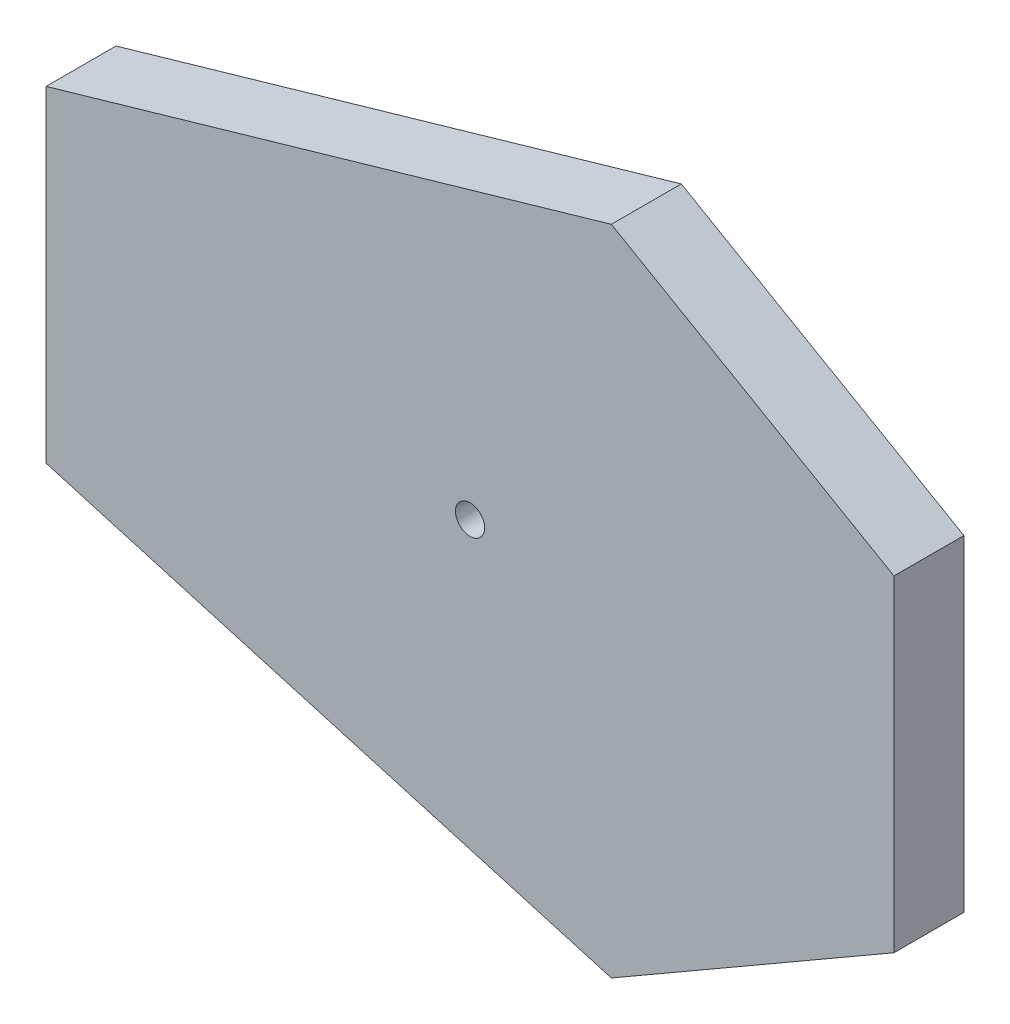
ISO-10303-21;
HEADER;
FILE_DESCRIPTION(('STEP AP214'),'2;1');
FILE_NAME('part.step','',(''),(''),'','','');
FILE_SCHEMA(('AUTOMOTIVE_DESIGN { 1 0 10303 214 1 1 1 1 }'));
ENDSEC;
DATA;
#1=APPLICATION_CONTEXT('core data for automotive mechanical design processes');
#2=APPLICATION_PROTOCOL_DEFINITION('international standard','automotive_design',2000,#1);
#3=PRODUCT_CONTEXT('',#1,'mechanical');
#4=PRODUCT('Part','Part','',(#3));
#5=PRODUCT_RELATED_PRODUCT_CATEGORY('part','',(#4));
#6=PRODUCT_DEFINITION_FORMATION('','',#4);
#7=PRODUCT_DEFINITION_CONTEXT('part definition',#1,'design');
#8=PRODUCT_DEFINITION('design','',#6,#7);
#9=PRODUCT_DEFINITION_SHAPE('','',#8);
#10=(LENGTH_UNIT() NAMED_UNIT(*) SI_UNIT(.MILLI.,.METRE.));
#11=(NAMED_UNIT(*) PLANE_ANGLE_UNIT() SI_UNIT($,.RADIAN.));
#12=(NAMED_UNIT(*) SI_UNIT($,.STERADIAN.) SOLID_ANGLE_UNIT());
#13=UNCERTAINTY_MEASURE_WITH_UNIT(LENGTH_MEASURE(1.E-05),#10,'distance_accuracy_value','');
#14=(GEOMETRIC_REPRESENTATION_CONTEXT(3) GLOBAL_UNCERTAINTY_ASSIGNED_CONTEXT((#13)) GLOBAL_UNIT_ASSIGNED_CONTEXT((#10,
#11,#12)) REPRESENTATION_CONTEXT('',''));
#15=CARTESIAN_POINT('',(0.,0.,0.));
#16=DIRECTION('',(0.,0.,1.));
#17=DIRECTION('',(1.,0.,0.));
#18=AXIS2_PLACEMENT_3D('',#15,#16,#17);
#19=CARTESIAN_POINT('',(-5.15000000000038,-1.45716771982052E-13,6.));
#20=DIRECTION('',(0.,0.,-1.));
#21=DIRECTION('',(-1.,0.,0.));
#22=AXIS2_PLACEMENT_3D('',#19,#20,#21);
#23=CYLINDRICAL_SURFACE('',#22,1.25000000000038);
#24=CARTESIAN_POINT('',(-5.15000000000038,-1.45716771982052E-13,6.));
#25=DIRECTION('',(0.,0.,1.));
#26=DIRECTION('',(1.,0.,0.));
#27=AXIS2_PLACEMENT_3D('',#24,#25,#26);
#28=CIRCLE('',#27,1.25000000000038);
#29=CARTESIAN_POINT('',(-3.9,-1.45716771982052E-13,6.));
#30=VERTEX_POINT('',#29);
#31=EDGE_CURVE('E124',#30,#30,#28,.T.);
#32=ORIENTED_EDGE('',*,*,#31,.T.);
#33=EDGE_LOOP('',(#32));
#34=FACE_BOUND('',#33,.T.);
#35=CARTESIAN_POINT('',(-5.15000000000038,-1.45716771982052E-13,3.));
#36=DIRECTION('',(0.,0.,-1.));
#37=DIRECTION('',(-1.,0.,0.));
#38=AXIS2_PLACEMENT_3D('',#35,#36,#37);
#39=CIRCLE('',#38,1.25000000000038);
#40=CARTESIAN_POINT('',(-6.40000000000076,-1.45716771982052E-13,3.));
#41=VERTEX_POINT('',#40);
#42=EDGE_CURVE('E37',#41,#41,#39,.T.);
#43=ORIENTED_EDGE('',*,*,#42,.T.);
#44=EDGE_LOOP('',(#43));
#45=FACE_BOUND('',#44,.T.);
#46=ADVANCED_FACE('F33',(#34,#45),#23,.F.);
#47=CARTESIAN_POINT('',(0.,0.,6.));
#48=DIRECTION('',(0.,0.,1.));
#49=DIRECTION('',(1.,0.,0.));
#50=AXIS2_PLACEMENT_3D('',#47,#48,#49);
#51=PLANE('',#50);
#52=DIRECTION('',(-0.960768922830523,-0.277350098112614,0.));
#53=VECTOR('',#52,1.);
#54=CARTESIAN_POINT('',(-41.5230669589465,14.,6.));
#55=LINE('',#54,#53);
#56=CARTESIAN_POINT('',(6.97435565298217,28.,6.));
#57=VERTEX_POINT('',#56);
#58=CARTESIAN_POINT('',(-41.5230669589465,14.,6.));
#59=VERTEX_POINT('',#58);
#60=EDGE_CURVE('E131',#57,#59,#55,.T.);
#61=ORIENTED_EDGE('',*,*,#60,.T.);
#62=DIRECTION('',(0.,-1.,0.));
#63=VECTOR('',#62,1.);
#64=CARTESIAN_POINT('',(-41.5230669589465,14.,6.));
#65=LINE('',#64,#63);
#66=CARTESIAN_POINT('',(-41.5230669589465,-14.,6.));
#67=VERTEX_POINT('',#66);
#68=EDGE_CURVE('E88',#59,#67,#65,.T.);
#69=ORIENTED_EDGE('',*,*,#68,.T.);
#70=DIRECTION('',(0.960768922830523,-0.277350098112614,0.));
#71=VECTOR('',#70,1.);
#72=CARTESIAN_POINT('',(6.97435565298217,-28.,6.));
#73=LINE('',#72,#71);
#74=CARTESIAN_POINT('',(6.97435565298217,-28.,6.));
#75=VERTEX_POINT('',#74);
#76=EDGE_CURVE('E102',#67,#75,#73,.T.);
#77=ORIENTED_EDGE('',*,*,#76,.T.);
#78=DIRECTION('',(0.866025403784439,0.5,0.));
#79=VECTOR('',#78,1.);
#80=CARTESIAN_POINT('',(6.97435565298217,-28.,6.));
#81=LINE('',#80,#79);
#82=CARTESIAN_POINT('',(31.2230669589464,-14.,6.));
#83=VERTEX_POINT('',#82);
#84=EDGE_CURVE('E95',#75,#83,#81,.T.);
#85=ORIENTED_EDGE('',*,*,#84,.T.);
#86=DIRECTION('',(0.,1.,0.));
#87=VECTOR('',#86,1.);
#88=CARTESIAN_POINT('',(31.2230669589464,-14.,6.));
#89=LINE('',#88,#87);
#90=CARTESIAN_POINT('',(31.2230669589464,14.,6.));
#91=VERTEX_POINT('',#90);
#92=EDGE_CURVE('E100',#83,#91,#89,.T.);
#93=ORIENTED_EDGE('',*,*,#92,.T.);
#94=DIRECTION('',(-0.866025403784439,0.5,0.));
#95=VECTOR('',#94,1.);
#96=CARTESIAN_POINT('',(31.2230669589464,14.,6.));
#97=LINE('',#96,#95);
#98=EDGE_CURVE('E51',#91,#57,#97,.T.);
#99=ORIENTED_EDGE('',*,*,#98,.T.);
#100=EDGE_LOOP('',(#61,#69,#77,#85,#93,#99));
#101=FACE_BOUND('',#100,.T.);
#102=ORIENTED_EDGE('',*,*,#31,.F.);
#103=EDGE_LOOP('',(#102));
#104=FACE_BOUND('',#103,.T.);
#105=ADVANCED_FACE('F97',(#101,#104),#51,.T.);
#106=CARTESIAN_POINT('',(0.,0.,0.));
#107=DIRECTION('',(0.,0.,1.));
#108=DIRECTION('',(1.,0.,0.));
#109=AXIS2_PLACEMENT_3D('',#106,#107,#108);
#110=PLANE('',#109);
#111=CARTESIAN_POINT('',(-5.15000000000038,-1.45716771982052E-13,0.));
#112=DIRECTION('',(0.,0.,-1.));
#113=DIRECTION('',(-1.,0.,0.));
#114=AXIS2_PLACEMENT_3D('',#111,#112,#113);
#115=CIRCLE('',#114,2.1);
#116=CARTESIAN_POINT('',(-7.25000000000038,-1.45716771982052E-13,0.));
#117=VERTEX_POINT('',#116);
#118=EDGE_CURVE('E176',#117,#117,#115,.T.);
#119=ORIENTED_EDGE('',*,*,#118,.F.);
#120=EDGE_LOOP('',(#119));
#121=FACE_BOUND('',#120,.T.);
#122=DIRECTION('',(-0.960768922830523,-0.277350098112614,0.));
#123=VECTOR('',#122,1.);
#124=CARTESIAN_POINT('',(-41.5230669589465,14.,0.));
#125=LINE('',#124,#123);
#126=CARTESIAN_POINT('',(6.97435565298217,28.,0.));
#127=VERTEX_POINT('',#126);
#128=CARTESIAN_POINT('',(-41.5230669589465,14.,0.));
#129=VERTEX_POINT('',#128);
#130=EDGE_CURVE('E120',#127,#129,#125,.T.);
#131=ORIENTED_EDGE('',*,*,#130,.F.);
#132=DIRECTION('',(-0.866025403784439,0.5,0.));
#133=VECTOR('',#132,1.);
#134=CARTESIAN_POINT('',(31.2230669589464,14.,0.));
#135=LINE('',#134,#133);
#136=CARTESIAN_POINT('',(31.2230669589464,14.,0.));
#137=VERTEX_POINT('',#136);
#138=EDGE_CURVE('E80',#137,#127,#135,.T.);
#139=ORIENTED_EDGE('',*,*,#138,.F.);
#140=DIRECTION('',(0.,1.,0.));
#141=VECTOR('',#140,1.);
#142=CARTESIAN_POINT('',(31.2230669589464,-14.,0.));
#143=LINE('',#142,#141);
#144=CARTESIAN_POINT('',(31.2230669589464,-14.,0.));
#145=VERTEX_POINT('',#144);
#146=EDGE_CURVE('E74',#145,#137,#143,.T.);
#147=ORIENTED_EDGE('',*,*,#146,.F.);
#148=DIRECTION('',(0.866025403784439,0.5,0.));
#149=VECTOR('',#148,1.);
#150=CARTESIAN_POINT('',(6.97435565298217,-28.,0.));
#151=LINE('',#150,#149);
#152=CARTESIAN_POINT('',(6.97435565298217,-28.,0.));
#153=VERTEX_POINT('',#152);
#154=EDGE_CURVE('E110',#153,#145,#151,.T.);
#155=ORIENTED_EDGE('',*,*,#154,.F.);
#156=DIRECTION('',(0.960768922830523,-0.277350098112614,0.));
#157=VECTOR('',#156,1.);
#158=CARTESIAN_POINT('',(6.97435565298217,-28.,0.));
#159=LINE('',#158,#157);
#160=CARTESIAN_POINT('',(-41.5230669589465,-14.,0.));
#161=VERTEX_POINT('',#160);
#162=EDGE_CURVE('E126',#161,#153,#159,.T.);
#163=ORIENTED_EDGE('',*,*,#162,.F.);
#164=DIRECTION('',(0.,-1.,0.));
#165=VECTOR('',#164,1.);
#166=CARTESIAN_POINT('',(-41.5230669589465,14.,0.));
#167=LINE('',#166,#165);
#168=EDGE_CURVE('E123',#129,#161,#167,.T.);
#169=ORIENTED_EDGE('',*,*,#168,.F.);
#170=EDGE_LOOP('',(#131,#139,#147,#155,#163,#169));
#171=FACE_BOUND('',#170,.T.);
#172=ADVANCED_FACE('F141',(#121,#171),#110,.F.);
#173=CARTESIAN_POINT('',(-41.5230669589465,14.,6.));
#174=DIRECTION('',(0.277350098112614,-0.960768922830523,0.));
#175=DIRECTION('',(0.960768922830523,0.277350098112614,0.));
#176=AXIS2_PLACEMENT_3D('',#173,#174,#175);
#177=PLANE('',#176);
#178=ORIENTED_EDGE('',*,*,#130,.T.);
#179=DIRECTION('',(0.,0.,-1.));
#180=VECTOR('',#179,1.);
#181=CARTESIAN_POINT('',(-41.5230669589465,14.,6.));
#182=LINE('',#181,#180);
#183=EDGE_CURVE('E11',#59,#129,#182,.T.);
#184=ORIENTED_EDGE('',*,*,#183,.F.);
#185=ORIENTED_EDGE('',*,*,#60,.F.);
#186=DIRECTION('',(0.,0.,-1.));
#187=VECTOR('',#186,1.);
#188=CARTESIAN_POINT('',(6.97435565298217,28.,6.));
#189=LINE('',#188,#187);
#190=EDGE_CURVE('E116',#57,#127,#189,.T.);
#191=ORIENTED_EDGE('',*,*,#190,.T.);
#192=EDGE_LOOP('',(#178,#184,#185,#191));
#193=FACE_BOUND('',#192,.T.);
#194=ADVANCED_FACE('F35',(#193),#177,.F.);
#195=CARTESIAN_POINT('',(-41.5230669589465,14.,6.));
#196=DIRECTION('',(1.,0.,0.));
#197=DIRECTION('',(0.,0.,-1.));
#198=AXIS2_PLACEMENT_3D('',#195,#196,#197);
#199=PLANE('',#198);
#200=ORIENTED_EDGE('',*,*,#168,.T.);
#201=DIRECTION('',(0.,0.,-1.));
#202=VECTOR('',#201,1.);
#203=CARTESIAN_POINT('',(-41.5230669589465,-14.,6.));
#204=LINE('',#203,#202);
#205=EDGE_CURVE('E43',#67,#161,#204,.T.);
#206=ORIENTED_EDGE('',*,*,#205,.F.);
#207=ORIENTED_EDGE('',*,*,#68,.F.);
#208=ORIENTED_EDGE('',*,*,#183,.T.);
#209=EDGE_LOOP('',(#200,#206,#207,#208));
#210=FACE_BOUND('',#209,.T.);
#211=ADVANCED_FACE('F173',(#210),#199,.F.);
#212=CARTESIAN_POINT('',(6.97435565298217,-28.,6.));
#213=DIRECTION('',(0.277350098112614,0.960768922830523,0.));
#214=DIRECTION('',(-0.960768922830523,0.277350098112614,0.));
#215=AXIS2_PLACEMENT_3D('',#212,#213,#214);
#216=PLANE('',#215);
#217=ORIENTED_EDGE('',*,*,#162,.T.);
#218=DIRECTION('',(0.,0.,-1.));
#219=VECTOR('',#218,1.);
#220=CARTESIAN_POINT('',(6.97435565298217,-28.,6.));
#221=LINE('',#220,#219);
#222=EDGE_CURVE('E111',#75,#153,#221,.T.);
#223=ORIENTED_EDGE('',*,*,#222,.F.);
#224=ORIENTED_EDGE('',*,*,#76,.F.);
#225=ORIENTED_EDGE('',*,*,#205,.T.);
#226=EDGE_LOOP('',(#217,#223,#224,#225));
#227=FACE_BOUND('',#226,.T.);
#228=ADVANCED_FACE('F138',(#227),#216,.F.);
#229=CARTESIAN_POINT('',(6.97435565298217,-28.,6.));
#230=DIRECTION('',(-0.5,0.866025403784439,0.));
#231=DIRECTION('',(-0.866025403784439,-0.5,0.));
#232=AXIS2_PLACEMENT_3D('',#229,#230,#231);
#233=PLANE('',#232);
#234=ORIENTED_EDGE('',*,*,#154,.T.);
#235=DIRECTION('',(0.,0.,-1.));
#236=VECTOR('',#235,1.);
#237=CARTESIAN_POINT('',(31.2230669589464,-14.,6.));
#238=LINE('',#237,#236);
#239=EDGE_CURVE('E107',#83,#145,#238,.T.);
#240=ORIENTED_EDGE('',*,*,#239,.F.);
#241=ORIENTED_EDGE('',*,*,#84,.F.);
#242=ORIENTED_EDGE('',*,*,#222,.T.);
#243=EDGE_LOOP('',(#234,#240,#241,#242));
#244=FACE_BOUND('',#243,.T.);
#245=ADVANCED_FACE('F108',(#244),#233,.F.);
#246=CARTESIAN_POINT('',(31.2230669589464,-14.,6.));
#247=DIRECTION('',(-1.,0.,0.));
#248=DIRECTION('',(0.,0.,1.));
#249=AXIS2_PLACEMENT_3D('',#246,#247,#248);
#250=PLANE('',#249);
#251=ORIENTED_EDGE('',*,*,#146,.T.);
#252=DIRECTION('',(0.,0.,-1.));
#253=VECTOR('',#252,1.);
#254=CARTESIAN_POINT('',(31.2230669589464,14.,6.));
#255=LINE('',#254,#253);
#256=EDGE_CURVE('E112',#91,#137,#255,.T.);
#257=ORIENTED_EDGE('',*,*,#256,.F.);
#258=ORIENTED_EDGE('',*,*,#92,.F.);
#259=ORIENTED_EDGE('',*,*,#239,.T.);
#260=EDGE_LOOP('',(#251,#257,#258,#259));
#261=FACE_BOUND('',#260,.T.);
#262=ADVANCED_FACE('F114',(#261),#250,.F.);
#263=CARTESIAN_POINT('',(31.2230669589464,14.,6.));
#264=DIRECTION('',(-0.5,-0.866025403784439,0.));
#265=DIRECTION('',(0.866025403784439,-0.5,0.));
#266=AXIS2_PLACEMENT_3D('',#263,#264,#265);
#267=PLANE('',#266);
#268=ORIENTED_EDGE('',*,*,#138,.T.);
#269=ORIENTED_EDGE('',*,*,#190,.F.);
#270=ORIENTED_EDGE('',*,*,#98,.F.);
#271=ORIENTED_EDGE('',*,*,#256,.T.);
#272=EDGE_LOOP('',(#268,#269,#270,#271));
#273=FACE_BOUND('',#272,.T.);
#274=ADVANCED_FACE('F145',(#273),#267,.F.);
#275=CARTESIAN_POINT('',(-5.15000000000038,-1.45716771982052E-13,3.));
#276=DIRECTION('',(0.,0.,-1.));
#277=DIRECTION('',(-1.,0.,0.));
#278=AXIS2_PLACEMENT_3D('',#275,#276,#277);
#279=CYLINDRICAL_SURFACE('',#278,2.1);
#280=CARTESIAN_POINT('',(-5.15000000000038,-1.45716771982052E-13,3.));
#281=DIRECTION('',(0.,0.,-1.));
#282=DIRECTION('',(-1.,0.,0.));
#283=AXIS2_PLACEMENT_3D('',#280,#281,#282);
#284=CIRCLE('',#283,2.1);
#285=CARTESIAN_POINT('',(-7.25000000000038,-1.45716771982052E-13,3.));
#286=VERTEX_POINT('',#285);
#287=EDGE_CURVE('E178',#286,#286,#284,.T.);
#288=ORIENTED_EDGE('',*,*,#287,.F.);
#289=EDGE_LOOP('',(#288));
#290=FACE_BOUND('',#289,.T.);
#291=ORIENTED_EDGE('',*,*,#118,.T.);
#292=EDGE_LOOP('',(#291));
#293=FACE_BOUND('',#292,.T.);
#294=ADVANCED_FACE('F147',(#290,#293),#279,.F.);
#295=CARTESIAN_POINT('',(-5.15000000000038,-1.45716771982052E-13,3.));
#296=DIRECTION('',(0.,0.,-1.));
#297=DIRECTION('',(-1.,0.,0.));
#298=AXIS2_PLACEMENT_3D('',#295,#296,#297);
#299=PLANE('',#298);
#300=ORIENTED_EDGE('',*,*,#42,.F.);
#301=EDGE_LOOP('',(#300));
#302=FACE_BOUND('',#301,.T.);
#303=ORIENTED_EDGE('',*,*,#287,.T.);
#304=EDGE_LOOP('',(#303));
#305=FACE_BOUND('',#304,.T.);
#306=ADVANCED_FACE('F153',(#302,#305),#299,.T.);
#307=CLOSED_SHELL('',(#46,#105,#172,#194,#211,#228,#245,#262,#274,#294,#306));
#308=MANIFOLD_SOLID_BREP('B2',#307);
#309=ADVANCED_BREP_SHAPE_REPRESENTATION('',(#18,#308),#14);
#310=SHAPE_DEFINITION_REPRESENTATION(#9,#309);
ENDSEC;
END-ISO-10303-21;
